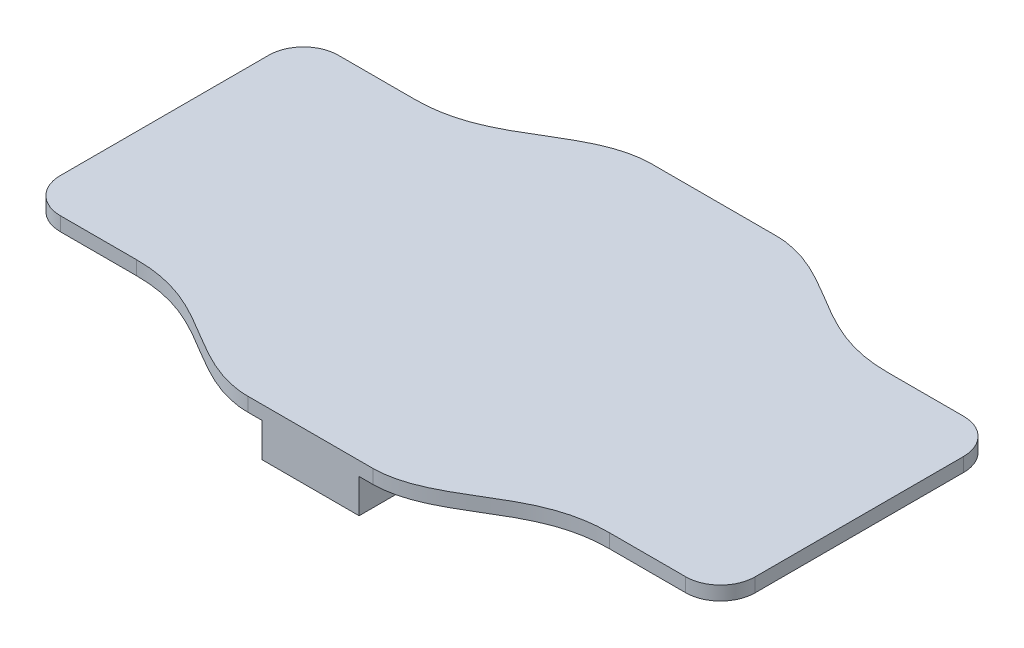
ISO-10303-21;
HEADER;
FILE_DESCRIPTION(('STEP AP214'),'2;1');
FILE_NAME('part.step','',(''),(''),'','','');
FILE_SCHEMA(('AUTOMOTIVE_DESIGN { 1 0 10303 214 1 1 1 1 }'));
ENDSEC;
DATA;
#1=APPLICATION_CONTEXT('core data for automotive mechanical design processes');
#2=APPLICATION_PROTOCOL_DEFINITION('international standard','automotive_design',2000,#1);
#3=PRODUCT_CONTEXT('',#1,'mechanical');
#4=PRODUCT('Part','Part','',(#3));
#5=PRODUCT_RELATED_PRODUCT_CATEGORY('part','',(#4));
#6=PRODUCT_DEFINITION_FORMATION('','',#4);
#7=PRODUCT_DEFINITION_CONTEXT('part definition',#1,'design');
#8=PRODUCT_DEFINITION('design','',#6,#7);
#9=PRODUCT_DEFINITION_SHAPE('','',#8);
#10=(LENGTH_UNIT() NAMED_UNIT(*) SI_UNIT(.MILLI.,.METRE.));
#11=(NAMED_UNIT(*) PLANE_ANGLE_UNIT() SI_UNIT($,.RADIAN.));
#12=(NAMED_UNIT(*) SI_UNIT($,.STERADIAN.) SOLID_ANGLE_UNIT());
#13=UNCERTAINTY_MEASURE_WITH_UNIT(LENGTH_MEASURE(1.E-05),#10,'distance_accuracy_value','');
#14=(GEOMETRIC_REPRESENTATION_CONTEXT(3) GLOBAL_UNCERTAINTY_ASSIGNED_CONTEXT((#13)) GLOBAL_UNIT_ASSIGNED_CONTEXT((#10,
#11,#12)) REPRESENTATION_CONTEXT('',''));
#15=CARTESIAN_POINT('',(0.,0.,0.));
#16=DIRECTION('',(0.,0.,1.));
#17=DIRECTION('',(1.,0.,0.));
#18=AXIS2_PLACEMENT_3D('',#15,#16,#17);
#19=CARTESIAN_POINT('',(-98.4375,0.,-125.3125));
#20=DIRECTION('',(0.,-1.,0.));
#21=DIRECTION('',(0.,0.,-1.));
#22=AXIS2_PLACEMENT_3D('',#19,#20,#21);
#23=PLANE('',#22);
#24=DIRECTION('',(1.,0.,0.));
#25=VECTOR('',#24,1.);
#26=CARTESIAN_POINT('',(45.,0.,145.));
#27=LINE('',#26,#25);
#28=CARTESIAN_POINT('',(35.,0.,145.));
#29=VERTEX_POINT('',#28);
#30=CARTESIAN_POINT('',(45.,0.,145.));
#31=VERTEX_POINT('',#30);
#32=EDGE_CURVE('E217',#29,#31,#27,.T.);
#33=ORIENTED_EDGE('',*,*,#32,.F.);
#34=DIRECTION('',(0.,0.,1.));
#35=VECTOR('',#34,1.);
#36=CARTESIAN_POINT('',(35.,0.,145.));
#37=LINE('',#36,#35);
#38=CARTESIAN_POINT('',(35.,0.,64.9999999999999));
#39=VERTEX_POINT('',#38);
#40=EDGE_CURVE('E211',#39,#29,#37,.T.);
#41=ORIENTED_EDGE('',*,*,#40,.F.);
#42=DIRECTION('',(1.,0.,0.));
#43=VECTOR('',#42,1.);
#44=CARTESIAN_POINT('',(35.,0.,64.9999999999999));
#45=LINE('',#44,#43);
#46=CARTESIAN_POINT('',(-35.,0.,64.9999999999999));
#47=VERTEX_POINT('',#46);
#48=EDGE_CURVE('E197',#47,#39,#45,.T.);
#49=ORIENTED_EDGE('',*,*,#48,.F.);
#50=DIRECTION('',(0.,0.,-1.));
#51=VECTOR('',#50,1.);
#52=CARTESIAN_POINT('',(-35.,0.,145.));
#53=LINE('',#52,#51);
#54=CARTESIAN_POINT('',(-35.,0.,145.));
#55=VERTEX_POINT('',#54);
#56=EDGE_CURVE('E204',#55,#47,#53,.T.);
#57=ORIENTED_EDGE('',*,*,#56,.F.);
#58=CARTESIAN_POINT('',(-45.,0.,145.));
#59=VERTEX_POINT('',#58);
#60=EDGE_CURVE('E344',#59,#55,#27,.T.);
#61=ORIENTED_EDGE('',*,*,#60,.F.);
#62=CARTESIAN_POINT('',(-170.,0.,100.));
#63=CARTESIAN_POINT('',(-120.,0.,100.));
#64=CARTESIAN_POINT('',(-100.,0.,130.));
#65=CARTESIAN_POINT('',(-70.,0.,145.));
#66=CARTESIAN_POINT('',(-45.,0.,145.));
#67=B_SPLINE_CURVE_WITH_KNOTS('',4,(#62,#63,#64,#65,#66),.UNSPECIFIED.,.F.,.F.,(5,5),(0.,1.),.UNSPECIFIED.);
#68=CARTESIAN_POINT('',(-170.,0.,100.));
#69=VERTEX_POINT('',#68);
#70=EDGE_CURVE('E340',#69,#59,#67,.T.);
#71=ORIENTED_EDGE('',*,*,#70,.F.);
#72=DIRECTION('',(1.,0.,0.));
#73=VECTOR('',#72,1.);
#74=CARTESIAN_POINT('',(-170.,0.,100.));
#75=LINE('',#74,#73);
#76=CARTESIAN_POINT('',(-225.,0.,100.));
#77=VERTEX_POINT('',#76);
#78=EDGE_CURVE('E254',#77,#69,#75,.T.);
#79=ORIENTED_EDGE('',*,*,#78,.F.);
#80=CARTESIAN_POINT('',(-225.,0.,75.));
#81=DIRECTION('',(0.,-1.,0.));
#82=DIRECTION('',(0.,0.,-1.));
#83=AXIS2_PLACEMENT_3D('',#80,#81,#82);
#84=CIRCLE('',#83,25.);
#85=CARTESIAN_POINT('',(-250.,0.,75.));
#86=VERTEX_POINT('',#85);
#87=EDGE_CURVE('E420',#77,#86,#84,.T.);
#88=ORIENTED_EDGE('',*,*,#87,.T.);
#89=DIRECTION('',(0.,0.,1.));
#90=VECTOR('',#89,1.);
#91=CARTESIAN_POINT('',(-250.,0.,-100.));
#92=LINE('',#91,#90);
#93=CARTESIAN_POINT('',(-250.,0.,-75.));
#94=VERTEX_POINT('',#93);
#95=EDGE_CURVE('E258',#94,#86,#92,.T.);
#96=ORIENTED_EDGE('',*,*,#95,.F.);
#97=CARTESIAN_POINT('',(-225.,0.,-75.));
#98=DIRECTION('',(0.,-1.,0.));
#99=DIRECTION('',(0.,0.,-1.));
#100=AXIS2_PLACEMENT_3D('',#97,#98,#99);
#101=CIRCLE('',#100,25.);
#102=CARTESIAN_POINT('',(-225.,0.,-100.));
#103=VERTEX_POINT('',#102);
#104=EDGE_CURVE('E422',#94,#103,#101,.T.);
#105=ORIENTED_EDGE('',*,*,#104,.T.);
#106=DIRECTION('',(-1.,0.,0.));
#107=VECTOR('',#106,1.);
#108=CARTESIAN_POINT('',(-170.,0.,-100.));
#109=LINE('',#108,#107);
#110=CARTESIAN_POINT('',(-170.,0.,-100.));
#111=VERTEX_POINT('',#110);
#112=EDGE_CURVE('E380',#111,#103,#109,.T.);
#113=ORIENTED_EDGE('',*,*,#112,.F.);
#114=CARTESIAN_POINT('',(-45.,0.,-145.));
#115=CARTESIAN_POINT('',(-70.,0.,-145.));
#116=CARTESIAN_POINT('',(-100.,0.,-130.));
#117=CARTESIAN_POINT('',(-120.,0.,-100.));
#118=CARTESIAN_POINT('',(-170.,0.,-100.));
#119=B_SPLINE_CURVE_WITH_KNOTS('',4,(#114,#115,#116,#117,#118),.UNSPECIFIED.,.F.,.F.,(5,5),(0.,
1.),.UNSPECIFIED.);
#120=CARTESIAN_POINT('',(-45.,0.,-145.));
#121=VERTEX_POINT('',#120);
#122=EDGE_CURVE('E376',#121,#111,#119,.T.);
#123=ORIENTED_EDGE('',*,*,#122,.F.);
#124=DIRECTION('',(-1.,0.,0.));
#125=VECTOR('',#124,1.);
#126=CARTESIAN_POINT('',(45.,0.,-145.));
#127=LINE('',#126,#125);
#128=CARTESIAN_POINT('',(-35.,0.,-145.));
#129=VERTEX_POINT('',#128);
#130=EDGE_CURVE('E369',#129,#121,#127,.T.);
#131=ORIENTED_EDGE('',*,*,#130,.F.);
#132=DIRECTION('',(0.,0.,-1.));
#133=VECTOR('',#132,1.);
#134=CARTESIAN_POINT('',(-35.,0.,-145.));
#135=LINE('',#134,#133);
#136=CARTESIAN_POINT('',(-35.,0.,-64.9999999999999));
#137=VERTEX_POINT('',#136);
#138=EDGE_CURVE('E234',#137,#129,#135,.T.);
#139=ORIENTED_EDGE('',*,*,#138,.F.);
#140=DIRECTION('',(-1.,0.,0.));
#141=VECTOR('',#140,1.);
#142=CARTESIAN_POINT('',(35.,0.,-64.9999999999999));
#143=LINE('',#142,#141);
#144=CARTESIAN_POINT('',(35.,0.,-64.9999999999999));
#145=VERTEX_POINT('',#144);
#146=EDGE_CURVE('E60',#145,#137,#143,.T.);
#147=ORIENTED_EDGE('',*,*,#146,.F.);
#148=DIRECTION('',(0.,0.,1.));
#149=VECTOR('',#148,1.);
#150=CARTESIAN_POINT('',(35.,0.,-145.));
#151=LINE('',#150,#149);
#152=CARTESIAN_POINT('',(35.,0.,-145.));
#153=VERTEX_POINT('',#152);
#154=EDGE_CURVE('E218',#153,#145,#151,.T.);
#155=ORIENTED_EDGE('',*,*,#154,.F.);
#156=CARTESIAN_POINT('',(45.,0.,-145.));
#157=VERTEX_POINT('',#156);
#158=EDGE_CURVE('E370',#157,#153,#127,.T.);
#159=ORIENTED_EDGE('',*,*,#158,.F.);
#160=CARTESIAN_POINT('',(170.,0.,-100.));
#161=CARTESIAN_POINT('',(120.,0.,-100.));
#162=CARTESIAN_POINT('',(100.,0.,-130.));
#163=CARTESIAN_POINT('',(70.,0.,-145.));
#164=CARTESIAN_POINT('',(45.,0.,-145.));
#165=B_SPLINE_CURVE_WITH_KNOTS('',4,(#160,#161,#162,#163,#164),.UNSPECIFIED.,.F.,.F.,(5,5),(0.,
1.),.UNSPECIFIED.);
#166=CARTESIAN_POINT('',(170.,0.,-100.));
#167=VERTEX_POINT('',#166);
#168=EDGE_CURVE('E365',#167,#157,#165,.T.);
#169=ORIENTED_EDGE('',*,*,#168,.F.);
#170=DIRECTION('',(-1.,0.,0.));
#171=VECTOR('',#170,1.);
#172=CARTESIAN_POINT('',(250.,0.,-100.));
#173=LINE('',#172,#171);
#174=CARTESIAN_POINT('',(225.,0.,-100.));
#175=VERTEX_POINT('',#174);
#176=EDGE_CURVE('E363',#175,#167,#173,.T.);
#177=ORIENTED_EDGE('',*,*,#176,.F.);
#178=CARTESIAN_POINT('',(225.,0.,-75.));
#179=DIRECTION('',(0.,-1.,0.));
#180=DIRECTION('',(0.,0.,-1.));
#181=AXIS2_PLACEMENT_3D('',#178,#179,#180);
#182=CIRCLE('',#181,25.);
#183=CARTESIAN_POINT('',(250.,0.,-75.));
#184=VERTEX_POINT('',#183);
#185=EDGE_CURVE('E418',#175,#184,#182,.T.);
#186=ORIENTED_EDGE('',*,*,#185,.T.);
#187=DIRECTION('',(0.,0.,-1.));
#188=VECTOR('',#187,1.);
#189=CARTESIAN_POINT('',(250.,0.,-100.));
#190=LINE('',#189,#188);
#191=CARTESIAN_POINT('',(250.,0.,75.));
#192=VERTEX_POINT('',#191);
#193=EDGE_CURVE('E360',#192,#184,#190,.T.);
#194=ORIENTED_EDGE('',*,*,#193,.F.);
#195=CARTESIAN_POINT('',(225.,0.,75.));
#196=DIRECTION('',(0.,-1.,0.));
#197=DIRECTION('',(0.,0.,-1.));
#198=AXIS2_PLACEMENT_3D('',#195,#196,#197);
#199=CIRCLE('',#198,25.);
#200=CARTESIAN_POINT('',(225.,0.,100.));
#201=VERTEX_POINT('',#200);
#202=EDGE_CURVE('E416',#192,#201,#199,.T.);
#203=ORIENTED_EDGE('',*,*,#202,.T.);
#204=DIRECTION('',(1.,0.,0.));
#205=VECTOR('',#204,1.);
#206=CARTESIAN_POINT('',(250.,0.,100.));
#207=LINE('',#206,#205);
#208=CARTESIAN_POINT('',(170.,0.,100.));
#209=VERTEX_POINT('',#208);
#210=EDGE_CURVE('E354',#209,#201,#207,.T.);
#211=ORIENTED_EDGE('',*,*,#210,.F.);
#212=CARTESIAN_POINT('',(45.,0.,145.));
#213=CARTESIAN_POINT('',(70.,0.,145.));
#214=CARTESIAN_POINT('',(100.,0.,130.));
#215=CARTESIAN_POINT('',(120.,0.,100.));
#216=CARTESIAN_POINT('',(170.,0.,100.));
#217=B_SPLINE_CURVE_WITH_KNOTS('',4,(#212,#213,#214,#215,#216),.UNSPECIFIED.,.F.,.F.,(5,5),(0.,
1.),.UNSPECIFIED.);
#218=EDGE_CURVE('E350',#31,#209,#217,.T.);
#219=ORIENTED_EDGE('',*,*,#218,.F.);
#220=EDGE_LOOP('',(#33,#41,#49,#57,#61,#71,#79,#88,#96,#105,#113,#123,#131,#139,#147,#155,#159,
#169,#177,#186,#194,#203,#211,#219));
#221=FACE_BOUND('',#220,.T.);
#222=ADVANCED_FACE('F37',(#221),#23,.T.);
#223=CARTESIAN_POINT('',(-170.,10.,100.));
#224=DIRECTION('',(0.,0.,-1.));
#225=DIRECTION('',(-1.,0.,0.));
#226=AXIS2_PLACEMENT_3D('',#223,#224,#225);
#227=PLANE('',#226);
#228=DIRECTION('',(1.,0.,0.));
#229=VECTOR('',#228,1.);
#230=CARTESIAN_POINT('',(-170.,10.,100.));
#231=LINE('',#230,#229);
#232=CARTESIAN_POINT('',(-225.,10.,100.));
#233=VERTEX_POINT('',#232);
#234=CARTESIAN_POINT('',(-170.,10.,100.));
#235=VERTEX_POINT('',#234);
#236=EDGE_CURVE('E255',#233,#235,#231,.T.);
#237=ORIENTED_EDGE('',*,*,#236,.F.);
#238=DIRECTION('',(0.,-1.,0.));
#239=VECTOR('',#238,1.);
#240=CARTESIAN_POINT('',(-225.,10.,100.));
#241=LINE('',#240,#239);
#242=EDGE_CURVE('E434',#233,#77,#241,.T.);
#243=ORIENTED_EDGE('',*,*,#242,.T.);
#244=ORIENTED_EDGE('',*,*,#78,.T.);
#245=DIRECTION('',(0.,-1.,0.));
#246=VECTOR('',#245,1.);
#247=CARTESIAN_POINT('',(-170.,10.,100.));
#248=LINE('',#247,#246);
#249=EDGE_CURVE('E408',#235,#69,#248,.T.);
#250=ORIENTED_EDGE('',*,*,#249,.F.);
#251=EDGE_LOOP('',(#237,#243,#244,#250));
#252=FACE_BOUND('',#251,.T.);
#253=ADVANCED_FACE('F274',(#252),#227,.F.);
#254=CARTESIAN_POINT('',(-170.,10.,100.));
#255=CARTESIAN_POINT('',(-120.,10.,100.));
#256=CARTESIAN_POINT('',(-100.,10.,130.));
#257=CARTESIAN_POINT('',(-70.,10.,145.));
#258=CARTESIAN_POINT('',(-45.,10.,145.));
#259=B_SPLINE_CURVE_WITH_KNOTS('',4,(#254,#255,#256,#257,#258),.UNSPECIFIED.,.F.,.F.,(5,5),(0.,
1.),.UNSPECIFIED.);
#260=DIRECTION('',(0.,-1.,0.));
#261=VECTOR('',#260,1.);
#262=SURFACE_OF_LINEAR_EXTRUSION('',#259,#261);
#263=ORIENTED_EDGE('',*,*,#70,.T.);
#264=DIRECTION('',(0.,-1.,0.));
#265=VECTOR('',#264,1.);
#266=CARTESIAN_POINT('',(-45.,10.,145.));
#267=LINE('',#266,#265);
#268=CARTESIAN_POINT('',(-45.,10.,145.));
#269=VERTEX_POINT('',#268);
#270=EDGE_CURVE('E405',#269,#59,#267,.T.);
#271=ORIENTED_EDGE('',*,*,#270,.F.);
#272=EDGE_CURVE('E257',#235,#269,#259,.T.);
#273=ORIENTED_EDGE('',*,*,#272,.F.);
#274=ORIENTED_EDGE('',*,*,#249,.T.);
#275=EDGE_LOOP('',(#263,#271,#273,#274));
#276=FACE_BOUND('',#275,.T.);
#277=ADVANCED_FACE('F269',(#276),#262,.F.);
#278=CARTESIAN_POINT('',(45.,10.,145.));
#279=DIRECTION('',(0.,0.,-1.));
#280=DIRECTION('',(-1.,0.,0.));
#281=AXIS2_PLACEMENT_3D('',#278,#279,#280);
#282=PLANE('',#281);
#283=ORIENTED_EDGE('',*,*,#60,.T.);
#284=DIRECTION('',(0.,1.,0.));
#285=VECTOR('',#284,1.);
#286=CARTESIAN_POINT('',(-35.,-24.5,145.));
#287=LINE('',#286,#285);
#288=CARTESIAN_POINT('',(-35.,-24.5,145.));
#289=VERTEX_POINT('',#288);
#290=EDGE_CURVE('E511',#289,#55,#287,.T.);
#291=ORIENTED_EDGE('',*,*,#290,.F.);
#292=DIRECTION('',(-1.,0.,0.));
#293=VECTOR('',#292,1.);
#294=CARTESIAN_POINT('',(35.,-24.5,145.));
#295=LINE('',#294,#293);
#296=CARTESIAN_POINT('',(35.,-24.5,145.));
#297=VERTEX_POINT('',#296);
#298=EDGE_CURVE('E227',#297,#289,#295,.T.);
#299=ORIENTED_EDGE('',*,*,#298,.F.);
#300=DIRECTION('',(0.,1.,0.));
#301=VECTOR('',#300,1.);
#302=CARTESIAN_POINT('',(35.,-24.5,145.));
#303=LINE('',#302,#301);
#304=EDGE_CURVE('E509',#297,#29,#303,.T.);
#305=ORIENTED_EDGE('',*,*,#304,.T.);
#306=ORIENTED_EDGE('',*,*,#32,.T.);
#307=DIRECTION('',(0.,-1.,0.));
#308=VECTOR('',#307,1.);
#309=CARTESIAN_POINT('',(45.,10.,145.));
#310=LINE('',#309,#308);
#311=CARTESIAN_POINT('',(45.,10.,145.));
#312=VERTEX_POINT('',#311);
#313=EDGE_CURVE('E402',#312,#31,#310,.T.);
#314=ORIENTED_EDGE('',*,*,#313,.F.);
#315=DIRECTION('',(1.,0.,0.));
#316=VECTOR('',#315,1.);
#317=CARTESIAN_POINT('',(45.,10.,145.));
#318=LINE('',#317,#316);
#319=EDGE_CURVE('E263',#269,#312,#318,.T.);
#320=ORIENTED_EDGE('',*,*,#319,.F.);
#321=ORIENTED_EDGE('',*,*,#270,.T.);
#322=EDGE_LOOP('',(#283,#291,#299,#305,#306,#314,#320,#321));
#323=FACE_BOUND('',#322,.T.);
#324=ADVANCED_FACE('F273',(#323),#282,.F.);
#325=CARTESIAN_POINT('',(45.,10.,145.));
#326=CARTESIAN_POINT('',(70.,10.,145.));
#327=CARTESIAN_POINT('',(100.,10.,130.));
#328=CARTESIAN_POINT('',(120.,10.,100.));
#329=CARTESIAN_POINT('',(170.,10.,100.));
#330=B_SPLINE_CURVE_WITH_KNOTS('',4,(#325,#326,#327,#328,#329),.UNSPECIFIED.,.F.,.F.,(5,5),(0.,
1.),.UNSPECIFIED.);
#331=DIRECTION('',(0.,-1.,0.));
#332=VECTOR('',#331,1.);
#333=SURFACE_OF_LINEAR_EXTRUSION('',#330,#332);
#334=ORIENTED_EDGE('',*,*,#218,.T.);
#335=DIRECTION('',(0.,-1.,0.));
#336=VECTOR('',#335,1.);
#337=CARTESIAN_POINT('',(170.,10.,100.));
#338=LINE('',#337,#336);
#339=CARTESIAN_POINT('',(170.,10.,100.));
#340=VERTEX_POINT('',#339);
#341=EDGE_CURVE('E399',#340,#209,#338,.T.);
#342=ORIENTED_EDGE('',*,*,#341,.F.);
#343=EDGE_CURVE('E493',#312,#340,#330,.T.);
#344=ORIENTED_EDGE('',*,*,#343,.F.);
#345=ORIENTED_EDGE('',*,*,#313,.T.);
#346=EDGE_LOOP('',(#334,#342,#344,#345));
#347=FACE_BOUND('',#346,.T.);
#348=ADVANCED_FACE('F489',(#347),#333,.F.);
#349=CARTESIAN_POINT('',(250.,10.,100.));
#350=DIRECTION('',(0.,0.,-1.));
#351=DIRECTION('',(-1.,0.,0.));
#352=AXIS2_PLACEMENT_3D('',#349,#350,#351);
#353=PLANE('',#352);
#354=ORIENTED_EDGE('',*,*,#210,.T.);
#355=DIRECTION('',(0.,-1.,0.));
#356=VECTOR('',#355,1.);
#357=CARTESIAN_POINT('',(225.,10.,100.));
#358=LINE('',#357,#356);
#359=CARTESIAN_POINT('',(225.,10.,100.));
#360=VERTEX_POINT('',#359);
#361=EDGE_CURVE('E11',#201,#360,#358,.F.);
#362=ORIENTED_EDGE('',*,*,#361,.T.);
#363=DIRECTION('',(1.,0.,0.));
#364=VECTOR('',#363,1.);
#365=CARTESIAN_POINT('',(250.,10.,100.));
#366=LINE('',#365,#364);
#367=EDGE_CURVE('E455',#340,#360,#366,.T.);
#368=ORIENTED_EDGE('',*,*,#367,.F.);
#369=ORIENTED_EDGE('',*,*,#341,.T.);
#370=EDGE_LOOP('',(#354,#362,#368,#369));
#371=FACE_BOUND('',#370,.T.);
#372=ADVANCED_FACE('F487',(#371),#353,.F.);
#373=CARTESIAN_POINT('',(250.,10.,-100.));
#374=DIRECTION('',(-1.,0.,0.));
#375=DIRECTION('',(0.,0.,1.));
#376=AXIS2_PLACEMENT_3D('',#373,#374,#375);
#377=PLANE('',#376);
#378=ORIENTED_EDGE('',*,*,#193,.T.);
#379=DIRECTION('',(0.,-1.,0.));
#380=VECTOR('',#379,1.);
#381=CARTESIAN_POINT('',(250.,10.,-75.));
#382=LINE('',#381,#380);
#383=CARTESIAN_POINT('',(250.,10.,-75.));
#384=VERTEX_POINT('',#383);
#385=EDGE_CURVE('E45',#184,#384,#382,.F.);
#386=ORIENTED_EDGE('',*,*,#385,.T.);
#387=DIRECTION('',(0.,0.,-1.));
#388=VECTOR('',#387,1.);
#389=CARTESIAN_POINT('',(250.,10.,-100.));
#390=LINE('',#389,#388);
#391=CARTESIAN_POINT('',(250.,10.,75.));
#392=VERTEX_POINT('',#391);
#393=EDGE_CURVE('E447',#392,#384,#390,.T.);
#394=ORIENTED_EDGE('',*,*,#393,.F.);
#395=DIRECTION('',(0.,-1.,0.));
#396=VECTOR('',#395,1.);
#397=CARTESIAN_POINT('',(250.,10.,75.));
#398=LINE('',#397,#396);
#399=EDGE_CURVE('E440',#392,#192,#398,.T.);
#400=ORIENTED_EDGE('',*,*,#399,.T.);
#401=EDGE_LOOP('',(#378,#386,#394,#400));
#402=FACE_BOUND('',#401,.T.);
#403=ADVANCED_FACE('F446',(#402),#377,.F.);
#404=CARTESIAN_POINT('',(250.,10.,-100.));
#405=DIRECTION('',(0.,0.,1.));
#406=DIRECTION('',(1.,0.,0.));
#407=AXIS2_PLACEMENT_3D('',#404,#405,#406);
#408=PLANE('',#407);
#409=DIRECTION('',(-1.,0.,0.));
#410=VECTOR('',#409,1.);
#411=CARTESIAN_POINT('',(250.,10.,-100.));
#412=LINE('',#411,#410);
#413=CARTESIAN_POINT('',(225.,10.,-100.));
#414=VERTEX_POINT('',#413);
#415=CARTESIAN_POINT('',(170.,10.,-100.));
#416=VERTEX_POINT('',#415);
#417=EDGE_CURVE('E454',#414,#416,#412,.T.);
#418=ORIENTED_EDGE('',*,*,#417,.F.);
#419=DIRECTION('',(0.,-1.,0.));
#420=VECTOR('',#419,1.);
#421=CARTESIAN_POINT('',(225.,10.,-100.));
#422=LINE('',#421,#420);
#423=EDGE_CURVE('E437',#414,#175,#422,.T.);
#424=ORIENTED_EDGE('',*,*,#423,.T.);
#425=ORIENTED_EDGE('',*,*,#176,.T.);
#426=DIRECTION('',(0.,-1.,0.));
#427=VECTOR('',#426,1.);
#428=CARTESIAN_POINT('',(170.,10.,-100.));
#429=LINE('',#428,#427);
#430=EDGE_CURVE('E396',#416,#167,#429,.T.);
#431=ORIENTED_EDGE('',*,*,#430,.F.);
#432=EDGE_LOOP('',(#418,#424,#425,#431));
#433=FACE_BOUND('',#432,.T.);
#434=ADVANCED_FACE('F460',(#433),#408,.F.);
#435=CARTESIAN_POINT('',(170.,10.,-100.));
#436=CARTESIAN_POINT('',(120.,10.,-100.));
#437=CARTESIAN_POINT('',(100.,10.,-130.));
#438=CARTESIAN_POINT('',(70.,10.,-145.));
#439=CARTESIAN_POINT('',(45.,10.,-145.));
#440=B_SPLINE_CURVE_WITH_KNOTS('',4,(#435,#436,#437,#438,#439),.UNSPECIFIED.,.F.,.F.,(5,5),(0.,
1.),.UNSPECIFIED.);
#441=DIRECTION('',(0.,-1.,0.));
#442=VECTOR('',#441,1.);
#443=SURFACE_OF_LINEAR_EXTRUSION('',#440,#442);
#444=ORIENTED_EDGE('',*,*,#168,.T.);
#445=DIRECTION('',(0.,-1.,0.));
#446=VECTOR('',#445,1.);
#447=CARTESIAN_POINT('',(45.,10.,-145.));
#448=LINE('',#447,#446);
#449=CARTESIAN_POINT('',(45.,10.,-145.));
#450=VERTEX_POINT('',#449);
#451=EDGE_CURVE('E393',#450,#157,#448,.T.);
#452=ORIENTED_EDGE('',*,*,#451,.F.);
#453=EDGE_CURVE('E473',#416,#450,#440,.T.);
#454=ORIENTED_EDGE('',*,*,#453,.F.);
#455=ORIENTED_EDGE('',*,*,#430,.T.);
#456=EDGE_LOOP('',(#444,#452,#454,#455));
#457=FACE_BOUND('',#456,.T.);
#458=ADVANCED_FACE('F466',(#457),#443,.F.);
#459=CARTESIAN_POINT('',(45.,10.,-145.));
#460=DIRECTION('',(0.,0.,1.));
#461=DIRECTION('',(1.,0.,0.));
#462=AXIS2_PLACEMENT_3D('',#459,#460,#461);
#463=PLANE('',#462);
#464=ORIENTED_EDGE('',*,*,#158,.T.);
#465=DIRECTION('',(0.,1.,0.));
#466=VECTOR('',#465,1.);
#467=CARTESIAN_POINT('',(35.,-24.5,-145.));
#468=LINE('',#467,#466);
#469=CARTESIAN_POINT('',(35.,-24.5,-145.));
#470=VERTEX_POINT('',#469);
#471=EDGE_CURVE('E239',#470,#153,#468,.T.);
#472=ORIENTED_EDGE('',*,*,#471,.F.);
#473=DIRECTION('',(1.,0.,0.));
#474=VECTOR('',#473,1.);
#475=CARTESIAN_POINT('',(35.,-24.5,-145.));
#476=LINE('',#475,#474);
#477=CARTESIAN_POINT('',(-35.,-24.5,-145.));
#478=VERTEX_POINT('',#477);
#479=EDGE_CURVE('E238',#478,#470,#476,.T.);
#480=ORIENTED_EDGE('',*,*,#479,.F.);
#481=DIRECTION('',(0.,1.,0.));
#482=VECTOR('',#481,1.);
#483=CARTESIAN_POINT('',(-35.,-24.5,-145.));
#484=LINE('',#483,#482);
#485=EDGE_CURVE('E246',#478,#129,#484,.T.);
#486=ORIENTED_EDGE('',*,*,#485,.T.);
#487=ORIENTED_EDGE('',*,*,#130,.T.);
#488=DIRECTION('',(0.,-1.,0.));
#489=VECTOR('',#488,1.);
#490=CARTESIAN_POINT('',(-45.,10.,-145.));
#491=LINE('',#490,#489);
#492=CARTESIAN_POINT('',(-45.,10.,-145.));
#493=VERTEX_POINT('',#492);
#494=EDGE_CURVE('E390',#493,#121,#491,.T.);
#495=ORIENTED_EDGE('',*,*,#494,.F.);
#496=DIRECTION('',(-1.,0.,0.));
#497=VECTOR('',#496,1.);
#498=CARTESIAN_POINT('',(45.,10.,-145.));
#499=LINE('',#498,#497);
#500=EDGE_CURVE('E328',#450,#493,#499,.T.);
#501=ORIENTED_EDGE('',*,*,#500,.F.);
#502=ORIENTED_EDGE('',*,*,#451,.T.);
#503=EDGE_LOOP('',(#464,#472,#480,#486,#487,#495,#501,#502));
#504=FACE_BOUND('',#503,.T.);
#505=ADVANCED_FACE('F318',(#504),#463,.F.);
#506=CARTESIAN_POINT('',(-45.,10.,-145.));
#507=CARTESIAN_POINT('',(-70.,10.,-145.));
#508=CARTESIAN_POINT('',(-100.,10.,-130.));
#509=CARTESIAN_POINT('',(-120.,10.,-100.));
#510=CARTESIAN_POINT('',(-170.,10.,-100.));
#511=B_SPLINE_CURVE_WITH_KNOTS('',4,(#506,#507,#508,#509,#510),.UNSPECIFIED.,.F.,.F.,(5,5),(0.,
1.),.UNSPECIFIED.);
#512=DIRECTION('',(0.,-1.,0.));
#513=VECTOR('',#512,1.);
#514=SURFACE_OF_LINEAR_EXTRUSION('',#511,#513);
#515=ORIENTED_EDGE('',*,*,#122,.T.);
#516=DIRECTION('',(0.,-1.,0.));
#517=VECTOR('',#516,1.);
#518=CARTESIAN_POINT('',(-170.,10.,-100.));
#519=LINE('',#518,#517);
#520=CARTESIAN_POINT('',(-170.,10.,-100.));
#521=VERTEX_POINT('',#520);
#522=EDGE_CURVE('E338',#521,#111,#519,.T.);
#523=ORIENTED_EDGE('',*,*,#522,.F.);
#524=EDGE_CURVE('E321',#493,#521,#511,.T.);
#525=ORIENTED_EDGE('',*,*,#524,.F.);
#526=ORIENTED_EDGE('',*,*,#494,.T.);
#527=EDGE_LOOP('',(#515,#523,#525,#526));
#528=FACE_BOUND('',#527,.T.);
#529=ADVANCED_FACE('F313',(#528),#514,.F.);
#530=CARTESIAN_POINT('',(-170.,10.,-100.));
#531=DIRECTION('',(0.,0.,1.));
#532=DIRECTION('',(1.,0.,0.));
#533=AXIS2_PLACEMENT_3D('',#530,#531,#532);
#534=PLANE('',#533);
#535=ORIENTED_EDGE('',*,*,#112,.T.);
#536=DIRECTION('',(0.,-1.,0.));
#537=VECTOR('',#536,1.);
#538=CARTESIAN_POINT('',(-225.,10.,-100.));
#539=LINE('',#538,#537);
#540=CARTESIAN_POINT('',(-225.,10.,-100.));
#541=VERTEX_POINT('',#540);
#542=EDGE_CURVE('E424',#103,#541,#539,.F.);
#543=ORIENTED_EDGE('',*,*,#542,.T.);
#544=DIRECTION('',(-1.,0.,0.));
#545=VECTOR('',#544,1.);
#546=CARTESIAN_POINT('',(-170.,10.,-100.));
#547=LINE('',#546,#545);
#548=EDGE_CURVE('E327',#521,#541,#547,.T.);
#549=ORIENTED_EDGE('',*,*,#548,.F.);
#550=ORIENTED_EDGE('',*,*,#522,.T.);
#551=EDGE_LOOP('',(#535,#543,#549,#550));
#552=FACE_BOUND('',#551,.T.);
#553=ADVANCED_FACE('F309',(#552),#534,.F.);
#554=CARTESIAN_POINT('',(-250.,10.,-100.));
#555=DIRECTION('',(1.,0.,0.));
#556=DIRECTION('',(0.,0.,-1.));
#557=AXIS2_PLACEMENT_3D('',#554,#555,#556);
#558=PLANE('',#557);
#559=DIRECTION('',(0.,0.,1.));
#560=VECTOR('',#559,1.);
#561=CARTESIAN_POINT('',(-250.,10.,-100.));
#562=LINE('',#561,#560);
#563=CARTESIAN_POINT('',(-250.,10.,-75.));
#564=VERTEX_POINT('',#563);
#565=CARTESIAN_POINT('',(-250.,10.,75.));
#566=VERTEX_POINT('',#565);
#567=EDGE_CURVE('E335',#564,#566,#562,.T.);
#568=ORIENTED_EDGE('',*,*,#567,.F.);
#569=DIRECTION('',(0.,-1.,0.));
#570=VECTOR('',#569,1.);
#571=CARTESIAN_POINT('',(-250.,10.,-75.));
#572=LINE('',#571,#570);
#573=EDGE_CURVE('E413',#564,#94,#572,.T.);
#574=ORIENTED_EDGE('',*,*,#573,.T.);
#575=ORIENTED_EDGE('',*,*,#95,.T.);
#576=DIRECTION('',(0.,-1.,0.));
#577=VECTOR('',#576,1.);
#578=CARTESIAN_POINT('',(-250.,10.,75.));
#579=LINE('',#578,#577);
#580=EDGE_CURVE('E411',#86,#566,#579,.F.);
#581=ORIENTED_EDGE('',*,*,#580,.T.);
#582=EDGE_LOOP('',(#568,#574,#575,#581));
#583=FACE_BOUND('',#582,.T.);
#584=ADVANCED_FACE('F306',(#583),#558,.F.);
#585=CARTESIAN_POINT('',(-98.4375,10.,-125.3125));
#586=DIRECTION('',(0.,-1.,0.));
#587=DIRECTION('',(0.,0.,-1.));
#588=AXIS2_PLACEMENT_3D('',#585,#586,#587);
#589=PLANE('',#588);
#590=ORIENTED_EDGE('',*,*,#548,.T.);
#591=CARTESIAN_POINT('',(-225.,10.,-75.));
#592=DIRECTION('',(0.,-1.,0.));
#593=DIRECTION('',(0.,0.,-1.));
#594=AXIS2_PLACEMENT_3D('',#591,#592,#593);
#595=CIRCLE('',#594,25.);
#596=EDGE_CURVE('E432',#541,#564,#595,.F.);
#597=ORIENTED_EDGE('',*,*,#596,.T.);
#598=ORIENTED_EDGE('',*,*,#567,.T.);
#599=CARTESIAN_POINT('',(-225.,10.,75.));
#600=DIRECTION('',(0.,-1.,0.));
#601=DIRECTION('',(0.,0.,-1.));
#602=AXIS2_PLACEMENT_3D('',#599,#600,#601);
#603=CIRCLE('',#602,25.);
#604=EDGE_CURVE('E430',#566,#233,#603,.F.);
#605=ORIENTED_EDGE('',*,*,#604,.T.);
#606=ORIENTED_EDGE('',*,*,#236,.T.);
#607=ORIENTED_EDGE('',*,*,#272,.T.);
#608=ORIENTED_EDGE('',*,*,#319,.T.);
#609=ORIENTED_EDGE('',*,*,#343,.T.);
#610=ORIENTED_EDGE('',*,*,#367,.T.);
#611=CARTESIAN_POINT('',(225.,10.,75.));
#612=DIRECTION('',(0.,-1.,0.));
#613=DIRECTION('',(0.,0.,-1.));
#614=AXIS2_PLACEMENT_3D('',#611,#612,#613);
#615=CIRCLE('',#614,25.);
#616=EDGE_CURVE('E426',#360,#392,#615,.F.);
#617=ORIENTED_EDGE('',*,*,#616,.T.);
#618=ORIENTED_EDGE('',*,*,#393,.T.);
#619=CARTESIAN_POINT('',(225.,10.,-75.));
#620=DIRECTION('',(0.,-1.,0.));
#621=DIRECTION('',(0.,0.,-1.));
#622=AXIS2_PLACEMENT_3D('',#619,#620,#621);
#623=CIRCLE('',#622,25.);
#624=EDGE_CURVE('E428',#384,#414,#623,.F.);
#625=ORIENTED_EDGE('',*,*,#624,.T.);
#626=ORIENTED_EDGE('',*,*,#417,.T.);
#627=ORIENTED_EDGE('',*,*,#453,.T.);
#628=ORIENTED_EDGE('',*,*,#500,.T.);
#629=ORIENTED_EDGE('',*,*,#524,.T.);
#630=EDGE_LOOP('',(#590,#597,#598,#605,#606,#607,#608,#609,#610,#617,#618,#625,#626,#627,#628,#629));
#631=FACE_BOUND('',#630,.T.);
#632=ADVANCED_FACE('F284',(#631),#589,.F.);
#633=CARTESIAN_POINT('',(-225.,10.,-75.));
#634=DIRECTION('',(0.,-1.,0.));
#635=DIRECTION('',(0.,0.,-1.));
#636=AXIS2_PLACEMENT_3D('',#633,#634,#635);
#637=CYLINDRICAL_SURFACE('',#636,25.);
#638=ORIENTED_EDGE('',*,*,#596,.F.);
#639=ORIENTED_EDGE('',*,*,#542,.F.);
#640=ORIENTED_EDGE('',*,*,#104,.F.);
#641=ORIENTED_EDGE('',*,*,#573,.F.);
#642=EDGE_LOOP('',(#638,#639,#640,#641));
#643=FACE_BOUND('',#642,.T.);
#644=ADVANCED_FACE('F280',(#643),#637,.T.);
#645=CARTESIAN_POINT('',(-225.,10.,75.));
#646=DIRECTION('',(0.,-1.,0.));
#647=DIRECTION('',(0.,0.,-1.));
#648=AXIS2_PLACEMENT_3D('',#645,#646,#647);
#649=CYLINDRICAL_SURFACE('',#648,25.);
#650=ORIENTED_EDGE('',*,*,#604,.F.);
#651=ORIENTED_EDGE('',*,*,#580,.F.);
#652=ORIENTED_EDGE('',*,*,#87,.F.);
#653=ORIENTED_EDGE('',*,*,#242,.F.);
#654=EDGE_LOOP('',(#650,#651,#652,#653));
#655=FACE_BOUND('',#654,.T.);
#656=ADVANCED_FACE('F283',(#655),#649,.T.);
#657=CARTESIAN_POINT('',(225.,10.,-75.));
#658=DIRECTION('',(0.,-1.,0.));
#659=DIRECTION('',(0.,0.,-1.));
#660=AXIS2_PLACEMENT_3D('',#657,#658,#659);
#661=CYLINDRICAL_SURFACE('',#660,25.);
#662=ORIENTED_EDGE('',*,*,#624,.F.);
#663=ORIENTED_EDGE('',*,*,#385,.F.);
#664=ORIENTED_EDGE('',*,*,#185,.F.);
#665=ORIENTED_EDGE('',*,*,#423,.F.);
#666=EDGE_LOOP('',(#662,#663,#664,#665));
#667=FACE_BOUND('',#666,.T.);
#668=ADVANCED_FACE('F287',(#667),#661,.T.);
#669=CARTESIAN_POINT('',(225.,10.,75.));
#670=DIRECTION('',(0.,-1.,0.));
#671=DIRECTION('',(0.,0.,-1.));
#672=AXIS2_PLACEMENT_3D('',#669,#670,#671);
#673=CYLINDRICAL_SURFACE('',#672,25.);
#674=ORIENTED_EDGE('',*,*,#616,.F.);
#675=ORIENTED_EDGE('',*,*,#361,.F.);
#676=ORIENTED_EDGE('',*,*,#202,.F.);
#677=ORIENTED_EDGE('',*,*,#399,.F.);
#678=EDGE_LOOP('',(#674,#675,#676,#677));
#679=FACE_BOUND('',#678,.T.);
#680=ADVANCED_FACE('F39',(#679),#673,.T.);
#681=CARTESIAN_POINT('',(35.,-24.5,-145.));
#682=DIRECTION('',(-1.,0.,0.));
#683=DIRECTION('',(0.,0.,1.));
#684=AXIS2_PLACEMENT_3D('',#681,#682,#683);
#685=PLANE('',#684);
#686=ORIENTED_EDGE('',*,*,#154,.T.);
#687=DIRECTION('',(0.,1.,0.));
#688=VECTOR('',#687,1.);
#689=CARTESIAN_POINT('',(35.,-24.5,-64.9999999999999));
#690=LINE('',#689,#688);
#691=CARTESIAN_POINT('',(35.,-24.5,-64.9999999999999));
#692=VERTEX_POINT('',#691);
#693=EDGE_CURVE('E252',#692,#145,#690,.T.);
#694=ORIENTED_EDGE('',*,*,#693,.F.);
#695=DIRECTION('',(0.,0.,1.));
#696=VECTOR('',#695,1.);
#697=CARTESIAN_POINT('',(35.,-24.5,-145.));
#698=LINE('',#697,#696);
#699=EDGE_CURVE('E230',#470,#692,#698,.T.);
#700=ORIENTED_EDGE('',*,*,#699,.F.);
#701=ORIENTED_EDGE('',*,*,#471,.T.);
#702=EDGE_LOOP('',(#686,#694,#700,#701));
#703=FACE_BOUND('',#702,.T.);
#704=ADVANCED_FACE('F294',(#703),#685,.F.);
#705=CARTESIAN_POINT('',(35.,-24.5,-64.9999999999999));
#706=DIRECTION('',(0.,0.,-1.));
#707=DIRECTION('',(-1.,0.,0.));
#708=AXIS2_PLACEMENT_3D('',#705,#706,#707);
#709=PLANE('',#708);
#710=ORIENTED_EDGE('',*,*,#146,.T.);
#711=DIRECTION('',(0.,1.,0.));
#712=VECTOR('',#711,1.);
#713=CARTESIAN_POINT('',(-35.,-24.5,-64.9999999999999));
#714=LINE('',#713,#712);
#715=CARTESIAN_POINT('',(-35.,-24.5,-64.9999999999999));
#716=VERTEX_POINT('',#715);
#717=EDGE_CURVE('E249',#716,#137,#714,.T.);
#718=ORIENTED_EDGE('',*,*,#717,.F.);
#719=DIRECTION('',(-1.,0.,0.));
#720=VECTOR('',#719,1.);
#721=CARTESIAN_POINT('',(35.,-24.5,-64.9999999999999));
#722=LINE('',#721,#720);
#723=EDGE_CURVE('E233',#692,#716,#722,.T.);
#724=ORIENTED_EDGE('',*,*,#723,.F.);
#725=ORIENTED_EDGE('',*,*,#693,.T.);
#726=EDGE_LOOP('',(#710,#718,#724,#725));
#727=FACE_BOUND('',#726,.T.);
#728=ADVANCED_FACE('F548',(#727),#709,.F.);
#729=CARTESIAN_POINT('',(-35.,-24.5,-145.));
#730=DIRECTION('',(1.,0.,0.));
#731=DIRECTION('',(0.,0.,-1.));
#732=AXIS2_PLACEMENT_3D('',#729,#730,#731);
#733=PLANE('',#732);
#734=ORIENTED_EDGE('',*,*,#138,.T.);
#735=ORIENTED_EDGE('',*,*,#485,.F.);
#736=DIRECTION('',(0.,0.,-1.));
#737=VECTOR('',#736,1.);
#738=CARTESIAN_POINT('',(-35.,-24.5,-145.));
#739=LINE('',#738,#737);
#740=EDGE_CURVE('E236',#716,#478,#739,.T.);
#741=ORIENTED_EDGE('',*,*,#740,.F.);
#742=ORIENTED_EDGE('',*,*,#717,.T.);
#743=EDGE_LOOP('',(#734,#735,#741,#742));
#744=FACE_BOUND('',#743,.T.);
#745=ADVANCED_FACE('F539',(#744),#733,.F.);
#746=CARTESIAN_POINT('',(0.,-24.5,0.));
#747=DIRECTION('',(0.,-1.,0.));
#748=DIRECTION('',(0.,0.,-1.));
#749=AXIS2_PLACEMENT_3D('',#746,#747,#748);
#750=PLANE('',#749);
#751=ORIENTED_EDGE('',*,*,#699,.T.);
#752=ORIENTED_EDGE('',*,*,#723,.T.);
#753=ORIENTED_EDGE('',*,*,#740,.T.);
#754=ORIENTED_EDGE('',*,*,#479,.T.);
#755=EDGE_LOOP('',(#751,#752,#753,#754));
#756=FACE_BOUND('',#755,.T.);
#757=ADVANCED_FACE('F545',(#756),#750,.T.);
#758=CARTESIAN_POINT('',(35.,-24.5,145.));
#759=DIRECTION('',(-1.,0.,0.));
#760=DIRECTION('',(0.,0.,1.));
#761=AXIS2_PLACEMENT_3D('',#758,#759,#760);
#762=PLANE('',#761);
#763=ORIENTED_EDGE('',*,*,#40,.T.);
#764=ORIENTED_EDGE('',*,*,#304,.F.);
#765=DIRECTION('',(0.,0.,1.));
#766=VECTOR('',#765,1.);
#767=CARTESIAN_POINT('',(35.,-24.5,145.));
#768=LINE('',#767,#766);
#769=CARTESIAN_POINT('',(35.,-24.5,64.9999999999999));
#770=VERTEX_POINT('',#769);
#771=EDGE_CURVE('E205',#770,#297,#768,.T.);
#772=ORIENTED_EDGE('',*,*,#771,.F.);
#773=DIRECTION('',(0.,1.,0.));
#774=VECTOR('',#773,1.);
#775=CARTESIAN_POINT('',(35.,-24.5,64.9999999999999));
#776=LINE('',#775,#774);
#777=EDGE_CURVE('E200',#770,#39,#776,.T.);
#778=ORIENTED_EDGE('',*,*,#777,.T.);
#779=EDGE_LOOP('',(#763,#764,#772,#778));
#780=FACE_BOUND('',#779,.T.);
#781=ADVANCED_FACE('F209',(#780),#762,.F.);
#782=CARTESIAN_POINT('',(-35.,-24.5,145.));
#783=DIRECTION('',(1.,0.,0.));
#784=DIRECTION('',(0.,0.,-1.));
#785=AXIS2_PLACEMENT_3D('',#782,#783,#784);
#786=PLANE('',#785);
#787=ORIENTED_EDGE('',*,*,#56,.T.);
#788=DIRECTION('',(0.,1.,0.));
#789=VECTOR('',#788,1.);
#790=CARTESIAN_POINT('',(-35.,-24.5,64.9999999999999));
#791=LINE('',#790,#789);
#792=CARTESIAN_POINT('',(-35.,-24.5,64.9999999999999));
#793=VERTEX_POINT('',#792);
#794=EDGE_CURVE('E52',#793,#47,#791,.T.);
#795=ORIENTED_EDGE('',*,*,#794,.F.);
#796=DIRECTION('',(0.,0.,-1.));
#797=VECTOR('',#796,1.);
#798=CARTESIAN_POINT('',(-35.,-24.5,145.));
#799=LINE('',#798,#797);
#800=EDGE_CURVE('E225',#289,#793,#799,.T.);
#801=ORIENTED_EDGE('',*,*,#800,.F.);
#802=ORIENTED_EDGE('',*,*,#290,.T.);
#803=EDGE_LOOP('',(#787,#795,#801,#802));
#804=FACE_BOUND('',#803,.T.);
#805=ADVANCED_FACE('F517',(#804),#786,.F.);
#806=CARTESIAN_POINT('',(35.,-24.5,64.9999999999999));
#807=DIRECTION('',(0.,0.,1.));
#808=DIRECTION('',(1.,0.,0.));
#809=AXIS2_PLACEMENT_3D('',#806,#807,#808);
#810=PLANE('',#809);
#811=ORIENTED_EDGE('',*,*,#48,.T.);
#812=ORIENTED_EDGE('',*,*,#777,.F.);
#813=DIRECTION('',(1.,0.,0.));
#814=VECTOR('',#813,1.);
#815=CARTESIAN_POINT('',(35.,-24.5,64.9999999999999));
#816=LINE('',#815,#814);
#817=EDGE_CURVE('E214',#793,#770,#816,.T.);
#818=ORIENTED_EDGE('',*,*,#817,.F.);
#819=ORIENTED_EDGE('',*,*,#794,.T.);
#820=EDGE_LOOP('',(#811,#812,#818,#819));
#821=FACE_BOUND('',#820,.T.);
#822=ADVANCED_FACE('F199',(#821),#810,.F.);
#823=CARTESIAN_POINT('',(0.,-24.5,0.));
#824=DIRECTION('',(0.,1.,0.));
#825=DIRECTION('',(0.,0.,1.));
#826=AXIS2_PLACEMENT_3D('',#823,#824,#825);
#827=PLANE('',#826);
#828=ORIENTED_EDGE('',*,*,#771,.T.);
#829=ORIENTED_EDGE('',*,*,#298,.T.);
#830=ORIENTED_EDGE('',*,*,#800,.T.);
#831=ORIENTED_EDGE('',*,*,#817,.T.);
#832=EDGE_LOOP('',(#828,#829,#830,#831));
#833=FACE_BOUND('',#832,.T.);
#834=ADVANCED_FACE('F561',(#833),#827,.F.);
#835=CLOSED_SHELL('',(#222,#253,#277,#324,#348,#372,#403,#434,#458,#505,#529,#553,#584,#632,
#644,#656,#668,#680,#704,#728,#745,#757,#781,#805,#822,#834));
#836=MANIFOLD_SOLID_BREP('B2',#835);
#837=ADVANCED_BREP_SHAPE_REPRESENTATION('',(#18,#836),#14);
#838=SHAPE_DEFINITION_REPRESENTATION(#9,#837);
ENDSEC;
END-ISO-10303-21;
